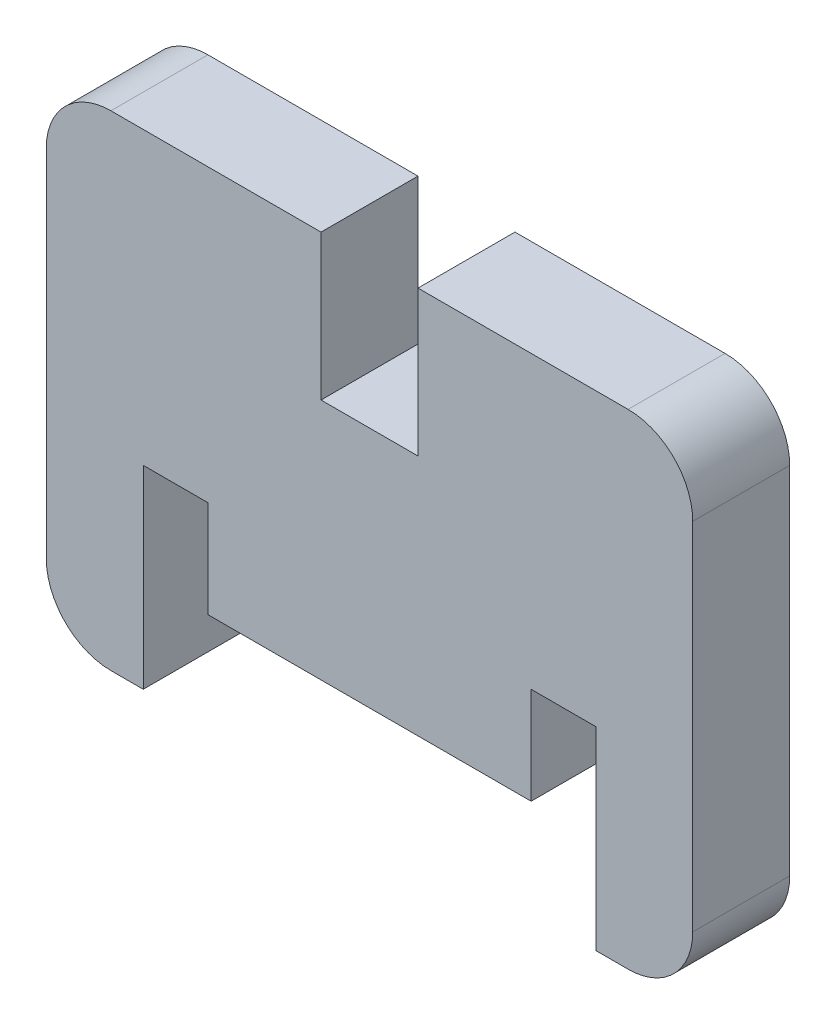
ISO-10303-21;
HEADER;
FILE_DESCRIPTION(('STEP AP214'),'2;1');
FILE_NAME('part.step','',(''),(''),'','','');
FILE_SCHEMA(('AUTOMOTIVE_DESIGN { 1 0 10303 214 1 1 1 1 }'));
ENDSEC;
DATA;
#1=APPLICATION_CONTEXT('core data for automotive mechanical design processes');
#2=APPLICATION_PROTOCOL_DEFINITION('international standard','automotive_design',2000,#1);
#3=PRODUCT_CONTEXT('',#1,'mechanical');
#4=PRODUCT('Part','Part','',(#3));
#5=PRODUCT_RELATED_PRODUCT_CATEGORY('part','',(#4));
#6=PRODUCT_DEFINITION_FORMATION('','',#4);
#7=PRODUCT_DEFINITION_CONTEXT('part definition',#1,'design');
#8=PRODUCT_DEFINITION('design','',#6,#7);
#9=PRODUCT_DEFINITION_SHAPE('','',#8);
#10=(LENGTH_UNIT() NAMED_UNIT(*) SI_UNIT(.MILLI.,.METRE.));
#11=(NAMED_UNIT(*) PLANE_ANGLE_UNIT() SI_UNIT($,.RADIAN.));
#12=(NAMED_UNIT(*) SI_UNIT($,.STERADIAN.) SOLID_ANGLE_UNIT());
#13=UNCERTAINTY_MEASURE_WITH_UNIT(LENGTH_MEASURE(1.E-05),#10,'distance_accuracy_value','');
#14=(GEOMETRIC_REPRESENTATION_CONTEXT(3) GLOBAL_UNCERTAINTY_ASSIGNED_CONTEXT((#13)) GLOBAL_UNIT_ASSIGNED_CONTEXT((#10,
#11,#12)) REPRESENTATION_CONTEXT('',''));
#15=CARTESIAN_POINT('',(0.,0.,0.));
#16=DIRECTION('',(0.,0.,1.));
#17=DIRECTION('',(1.,0.,0.));
#18=AXIS2_PLACEMENT_3D('',#15,#16,#17);
#19=CARTESIAN_POINT('',(0.,-37.5,15.));
#20=DIRECTION('',(0.,1.,0.));
#21=DIRECTION('',(0.,0.,1.));
#22=AXIS2_PLACEMENT_3D('',#19,#20,#21);
#23=PLANE('',#22);
#24=DIRECTION('',(1.,0.,0.));
#25=VECTOR('',#24,1.);
#26=CARTESIAN_POINT('',(0.,-37.5,0.));
#27=LINE('',#26,#25);
#28=CARTESIAN_POINT('',(35.,-37.5,0.));
#29=VERTEX_POINT('',#28);
#30=CARTESIAN_POINT('',(40.,-37.5,0.));
#31=VERTEX_POINT('',#30);
#32=EDGE_CURVE('E204',#29,#31,#27,.T.);
#33=ORIENTED_EDGE('',*,*,#32,.T.);
#34=DIRECTION('',(0.,0.,-1.));
#35=VECTOR('',#34,1.);
#36=CARTESIAN_POINT('',(40.,-37.5,15.));
#37=LINE('',#36,#35);
#38=CARTESIAN_POINT('',(40.,-37.5,15.));
#39=VERTEX_POINT('',#38);
#40=EDGE_CURVE('E11',#39,#31,#37,.T.);
#41=ORIENTED_EDGE('',*,*,#40,.F.);
#42=DIRECTION('',(1.,0.,0.));
#43=VECTOR('',#42,1.);
#44=CARTESIAN_POINT('',(0.,-37.5,15.));
#45=LINE('',#44,#43);
#46=CARTESIAN_POINT('',(35.,-37.5,15.));
#47=VERTEX_POINT('',#46);
#48=EDGE_CURVE('E253',#47,#39,#45,.T.);
#49=ORIENTED_EDGE('',*,*,#48,.F.);
#50=DIRECTION('',(0.,0.,-1.));
#51=VECTOR('',#50,1.);
#52=CARTESIAN_POINT('',(35.,-37.5,15.));
#53=LINE('',#52,#51);
#54=EDGE_CURVE('E51',#47,#29,#53,.T.);
#55=ORIENTED_EDGE('',*,*,#54,.T.);
#56=EDGE_LOOP('',(#33,#41,#49,#55));
#57=FACE_BOUND('',#56,.T.);
#58=ADVANCED_FACE('F34',(#57),#23,.F.);
#59=CARTESIAN_POINT('',(40.,-27.5,15.));
#60=DIRECTION('',(0.,0.,-1.));
#61=DIRECTION('',(-1.,0.,0.));
#62=AXIS2_PLACEMENT_3D('',#59,#60,#61);
#63=CYLINDRICAL_SURFACE('',#62,10.);
#64=CARTESIAN_POINT('',(40.,-27.5,0.));
#65=DIRECTION('',(0.,0.,1.));
#66=DIRECTION('',(1.,0.,0.));
#67=AXIS2_PLACEMENT_3D('',#64,#65,#66);
#68=CIRCLE('',#67,10.);
#69=CARTESIAN_POINT('',(50.,-27.4999999999999,0.));
#70=VERTEX_POINT('',#69);
#71=EDGE_CURVE('E206',#31,#70,#68,.T.);
#72=ORIENTED_EDGE('',*,*,#71,.T.);
#73=DIRECTION('',(0.,0.,-1.));
#74=VECTOR('',#73,1.);
#75=CARTESIAN_POINT('',(50.,-27.4999999999999,15.));
#76=LINE('',#75,#74);
#77=CARTESIAN_POINT('',(50.,-27.4999999999999,15.));
#78=VERTEX_POINT('',#77);
#79=EDGE_CURVE('E43',#78,#70,#76,.T.);
#80=ORIENTED_EDGE('',*,*,#79,.F.);
#81=CARTESIAN_POINT('',(40.,-27.5,15.));
#82=DIRECTION('',(0.,0.,1.));
#83=DIRECTION('',(1.,0.,0.));
#84=AXIS2_PLACEMENT_3D('',#81,#82,#83);
#85=CIRCLE('',#84,10.);
#86=EDGE_CURVE('E125',#39,#78,#85,.T.);
#87=ORIENTED_EDGE('',*,*,#86,.F.);
#88=ORIENTED_EDGE('',*,*,#40,.T.);
#89=EDGE_LOOP('',(#72,#80,#87,#88));
#90=FACE_BOUND('',#89,.T.);
#91=ADVANCED_FACE('F36',(#90),#63,.T.);
#92=CARTESIAN_POINT('',(50.,0.,15.));
#93=DIRECTION('',(-1.,0.,0.));
#94=DIRECTION('',(0.,0.,1.));
#95=AXIS2_PLACEMENT_3D('',#92,#93,#94);
#96=PLANE('',#95);
#97=DIRECTION('',(0.,1.,0.));
#98=VECTOR('',#97,1.);
#99=CARTESIAN_POINT('',(50.,0.,0.));
#100=LINE('',#99,#98);
#101=CARTESIAN_POINT('',(50.,27.4999999999999,0.));
#102=VERTEX_POINT('',#101);
#103=EDGE_CURVE('E209',#70,#102,#100,.T.);
#104=ORIENTED_EDGE('',*,*,#103,.T.);
#105=DIRECTION('',(0.,0.,-1.));
#106=VECTOR('',#105,1.);
#107=CARTESIAN_POINT('',(50.,27.4999999999999,15.));
#108=LINE('',#107,#106);
#109=CARTESIAN_POINT('',(50.,27.4999999999999,15.));
#110=VERTEX_POINT('',#109);
#111=EDGE_CURVE('E285',#110,#102,#108,.T.);
#112=ORIENTED_EDGE('',*,*,#111,.F.);
#113=DIRECTION('',(0.,1.,0.));
#114=VECTOR('',#113,1.);
#115=CARTESIAN_POINT('',(50.,0.,15.));
#116=LINE('',#115,#114);
#117=EDGE_CURVE('E293',#78,#110,#116,.T.);
#118=ORIENTED_EDGE('',*,*,#117,.F.);
#119=ORIENTED_EDGE('',*,*,#79,.T.);
#120=EDGE_LOOP('',(#104,#112,#118,#119));
#121=FACE_BOUND('',#120,.T.);
#122=ADVANCED_FACE('F291',(#121),#96,.F.);
#123=CARTESIAN_POINT('',(40.,27.5,15.));
#124=DIRECTION('',(0.,0.,-1.));
#125=DIRECTION('',(-1.,0.,0.));
#126=AXIS2_PLACEMENT_3D('',#123,#124,#125);
#127=CYLINDRICAL_SURFACE('',#126,10.);
#128=CARTESIAN_POINT('',(40.,27.5,0.));
#129=DIRECTION('',(0.,0.,1.));
#130=DIRECTION('',(1.,0.,0.));
#131=AXIS2_PLACEMENT_3D('',#128,#129,#130);
#132=CIRCLE('',#131,10.);
#133=CARTESIAN_POINT('',(40.,37.5,0.));
#134=VERTEX_POINT('',#133);
#135=EDGE_CURVE('E211',#102,#134,#132,.T.);
#136=ORIENTED_EDGE('',*,*,#135,.T.);
#137=DIRECTION('',(0.,0.,-1.));
#138=VECTOR('',#137,1.);
#139=CARTESIAN_POINT('',(40.,37.5,15.));
#140=LINE('',#139,#138);
#141=CARTESIAN_POINT('',(40.,37.5,15.));
#142=VERTEX_POINT('',#141);
#143=EDGE_CURVE('E283',#142,#134,#140,.T.);
#144=ORIENTED_EDGE('',*,*,#143,.F.);
#145=CARTESIAN_POINT('',(40.,27.5,15.));
#146=DIRECTION('',(0.,0.,1.));
#147=DIRECTION('',(1.,0.,0.));
#148=AXIS2_PLACEMENT_3D('',#145,#146,#147);
#149=CIRCLE('',#148,10.);
#150=EDGE_CURVE('E303',#110,#142,#149,.T.);
#151=ORIENTED_EDGE('',*,*,#150,.F.);
#152=ORIENTED_EDGE('',*,*,#111,.T.);
#153=EDGE_LOOP('',(#136,#144,#151,#152));
#154=FACE_BOUND('',#153,.T.);
#155=ADVANCED_FACE('F300',(#154),#127,.T.);
#156=CARTESIAN_POINT('',(0.,37.5,15.));
#157=DIRECTION('',(0.,1.,0.));
#158=DIRECTION('',(0.,0.,1.));
#159=AXIS2_PLACEMENT_3D('',#156,#157,#158);
#160=PLANE('',#159);
#161=DIRECTION('',(1.,0.,0.));
#162=VECTOR('',#161,1.);
#163=CARTESIAN_POINT('',(0.,37.5,0.));
#164=LINE('',#163,#162);
#165=CARTESIAN_POINT('',(7.50000000000001,37.5,0.));
#166=VERTEX_POINT('',#165);
#167=EDGE_CURVE('E214',#166,#134,#164,.T.);
#168=ORIENTED_EDGE('',*,*,#167,.F.);
#169=DIRECTION('',(0.,0.,-1.));
#170=VECTOR('',#169,1.);
#171=CARTESIAN_POINT('',(7.50000000000001,37.5,15.));
#172=LINE('',#171,#170);
#173=CARTESIAN_POINT('',(7.50000000000001,37.5,15.));
#174=VERTEX_POINT('',#173);
#175=EDGE_CURVE('E281',#174,#166,#172,.T.);
#176=ORIENTED_EDGE('',*,*,#175,.F.);
#177=DIRECTION('',(1.,0.,0.));
#178=VECTOR('',#177,1.);
#179=CARTESIAN_POINT('',(0.,37.5,15.));
#180=LINE('',#179,#178);
#181=EDGE_CURVE('E305',#174,#142,#180,.T.);
#182=ORIENTED_EDGE('',*,*,#181,.T.);
#183=ORIENTED_EDGE('',*,*,#143,.T.);
#184=EDGE_LOOP('',(#168,#176,#182,#183));
#185=FACE_BOUND('',#184,.T.);
#186=ADVANCED_FACE('F410',(#185),#160,.T.);
#187=CARTESIAN_POINT('',(7.50000000000001,0.,15.));
#188=DIRECTION('',(-1.,0.,0.));
#189=DIRECTION('',(0.,0.,1.));
#190=AXIS2_PLACEMENT_3D('',#187,#188,#189);
#191=PLANE('',#190);
#192=DIRECTION('',(0.,1.,0.));
#193=VECTOR('',#192,1.);
#194=CARTESIAN_POINT('',(7.50000000000001,0.,0.));
#195=LINE('',#194,#193);
#196=CARTESIAN_POINT('',(7.50000000000001,15.,0.));
#197=VERTEX_POINT('',#196);
#198=EDGE_CURVE('E217',#197,#166,#195,.T.);
#199=ORIENTED_EDGE('',*,*,#198,.F.);
#200=DIRECTION('',(0.,0.,-1.));
#201=VECTOR('',#200,1.);
#202=CARTESIAN_POINT('',(7.50000000000001,15.,15.));
#203=LINE('',#202,#201);
#204=CARTESIAN_POINT('',(7.50000000000001,15.,15.));
#205=VERTEX_POINT('',#204);
#206=EDGE_CURVE('E279',#205,#197,#203,.T.);
#207=ORIENTED_EDGE('',*,*,#206,.F.);
#208=DIRECTION('',(0.,1.,0.));
#209=VECTOR('',#208,1.);
#210=CARTESIAN_POINT('',(7.50000000000001,0.,15.));
#211=LINE('',#210,#209);
#212=EDGE_CURVE('E307',#205,#174,#211,.T.);
#213=ORIENTED_EDGE('',*,*,#212,.T.);
#214=ORIENTED_EDGE('',*,*,#175,.T.);
#215=EDGE_LOOP('',(#199,#207,#213,#214));
#216=FACE_BOUND('',#215,.T.);
#217=ADVANCED_FACE('F408',(#216),#191,.T.);
#218=CARTESIAN_POINT('',(0.,15.,15.));
#219=DIRECTION('',(0.,1.,0.));
#220=DIRECTION('',(0.,0.,1.));
#221=AXIS2_PLACEMENT_3D('',#218,#219,#220);
#222=PLANE('',#221);
#223=DIRECTION('',(1.,0.,0.));
#224=VECTOR('',#223,1.);
#225=CARTESIAN_POINT('',(0.,15.,0.));
#226=LINE('',#225,#224);
#227=CARTESIAN_POINT('',(-7.49999999999999,15.,0.));
#228=VERTEX_POINT('',#227);
#229=EDGE_CURVE('E221',#228,#197,#226,.T.);
#230=ORIENTED_EDGE('',*,*,#229,.F.);
#231=DIRECTION('',(0.,0.,-1.));
#232=VECTOR('',#231,1.);
#233=CARTESIAN_POINT('',(-7.49999999999999,15.,15.));
#234=LINE('',#233,#232);
#235=CARTESIAN_POINT('',(-7.49999999999999,15.,15.));
#236=VERTEX_POINT('',#235);
#237=EDGE_CURVE('E277',#236,#228,#234,.T.);
#238=ORIENTED_EDGE('',*,*,#237,.F.);
#239=DIRECTION('',(1.,0.,0.));
#240=VECTOR('',#239,1.);
#241=CARTESIAN_POINT('',(0.,15.,15.));
#242=LINE('',#241,#240);
#243=EDGE_CURVE('E315',#236,#205,#242,.T.);
#244=ORIENTED_EDGE('',*,*,#243,.T.);
#245=ORIENTED_EDGE('',*,*,#206,.T.);
#246=EDGE_LOOP('',(#230,#238,#244,#245));
#247=FACE_BOUND('',#246,.T.);
#248=ADVANCED_FACE('F402',(#247),#222,.T.);
#249=CARTESIAN_POINT('',(-7.49999999999999,0.,15.));
#250=DIRECTION('',(-1.,0.,0.));
#251=DIRECTION('',(0.,0.,1.));
#252=AXIS2_PLACEMENT_3D('',#249,#250,#251);
#253=PLANE('',#252);
#254=DIRECTION('',(0.,1.,0.));
#255=VECTOR('',#254,1.);
#256=CARTESIAN_POINT('',(-7.49999999999999,0.,0.));
#257=LINE('',#256,#255);
#258=CARTESIAN_POINT('',(-7.49999999999999,37.5,0.));
#259=VERTEX_POINT('',#258);
#260=EDGE_CURVE('E224',#228,#259,#257,.T.);
#261=ORIENTED_EDGE('',*,*,#260,.T.);
#262=DIRECTION('',(0.,0.,-1.));
#263=VECTOR('',#262,1.);
#264=CARTESIAN_POINT('',(-7.49999999999999,37.5,15.));
#265=LINE('',#264,#263);
#266=CARTESIAN_POINT('',(-7.49999999999999,37.5,15.));
#267=VERTEX_POINT('',#266);
#268=EDGE_CURVE('E275',#267,#259,#265,.T.);
#269=ORIENTED_EDGE('',*,*,#268,.F.);
#270=DIRECTION('',(0.,1.,0.));
#271=VECTOR('',#270,1.);
#272=CARTESIAN_POINT('',(-7.49999999999999,0.,15.));
#273=LINE('',#272,#271);
#274=EDGE_CURVE('E318',#236,#267,#273,.T.);
#275=ORIENTED_EDGE('',*,*,#274,.F.);
#276=ORIENTED_EDGE('',*,*,#237,.T.);
#277=EDGE_LOOP('',(#261,#269,#275,#276));
#278=FACE_BOUND('',#277,.T.);
#279=ADVANCED_FACE('F411',(#278),#253,.F.);
#280=CARTESIAN_POINT('',(-39.9999999999999,37.5,0.));
#281=VERTEX_POINT('',#280);
#282=EDGE_CURVE('E218',#281,#259,#164,.T.);
#283=ORIENTED_EDGE('',*,*,#282,.F.);
#284=DIRECTION('',(0.,0.,-1.));
#285=VECTOR('',#284,1.);
#286=CARTESIAN_POINT('',(-39.9999999999999,37.5,15.));
#287=LINE('',#286,#285);
#288=CARTESIAN_POINT('',(-39.9999999999999,37.5,15.));
#289=VERTEX_POINT('',#288);
#290=EDGE_CURVE('E273',#289,#281,#287,.T.);
#291=ORIENTED_EDGE('',*,*,#290,.F.);
#292=EDGE_CURVE('E309',#289,#267,#180,.T.);
#293=ORIENTED_EDGE('',*,*,#292,.T.);
#294=ORIENTED_EDGE('',*,*,#268,.T.);
#295=EDGE_LOOP('',(#283,#291,#293,#294));
#296=FACE_BOUND('',#295,.T.);
#297=ADVANCED_FACE('F396',(#296),#160,.T.);
#298=CARTESIAN_POINT('',(-40.,27.5,15.));
#299=DIRECTION('',(0.,0.,-1.));
#300=DIRECTION('',(-1.,0.,0.));
#301=AXIS2_PLACEMENT_3D('',#298,#299,#300);
#302=CYLINDRICAL_SURFACE('',#301,10.);
#303=CARTESIAN_POINT('',(-40.,27.5,0.));
#304=DIRECTION('',(0.,0.,1.));
#305=DIRECTION('',(1.,0.,0.));
#306=AXIS2_PLACEMENT_3D('',#303,#304,#305);
#307=CIRCLE('',#306,10.);
#308=CARTESIAN_POINT('',(-50.,27.4999999999999,0.));
#309=VERTEX_POINT('',#308);
#310=EDGE_CURVE('E227',#281,#309,#307,.T.);
#311=ORIENTED_EDGE('',*,*,#310,.T.);
#312=DIRECTION('',(0.,0.,-1.));
#313=VECTOR('',#312,1.);
#314=CARTESIAN_POINT('',(-50.,27.4999999999999,15.));
#315=LINE('',#314,#313);
#316=CARTESIAN_POINT('',(-50.,27.4999999999999,15.));
#317=VERTEX_POINT('',#316);
#318=EDGE_CURVE('E271',#317,#309,#315,.T.);
#319=ORIENTED_EDGE('',*,*,#318,.F.);
#320=CARTESIAN_POINT('',(-40.,27.5,15.));
#321=DIRECTION('',(0.,0.,1.));
#322=DIRECTION('',(1.,0.,0.));
#323=AXIS2_PLACEMENT_3D('',#320,#321,#322);
#324=CIRCLE('',#323,10.);
#325=EDGE_CURVE('E320',#289,#317,#324,.T.);
#326=ORIENTED_EDGE('',*,*,#325,.F.);
#327=ORIENTED_EDGE('',*,*,#290,.T.);
#328=EDGE_LOOP('',(#311,#319,#326,#327));
#329=FACE_BOUND('',#328,.T.);
#330=ADVANCED_FACE('F392',(#329),#302,.T.);
#331=CARTESIAN_POINT('',(-50.,0.,15.));
#332=DIRECTION('',(-1.,0.,0.));
#333=DIRECTION('',(0.,0.,1.));
#334=AXIS2_PLACEMENT_3D('',#331,#332,#333);
#335=PLANE('',#334);
#336=DIRECTION('',(0.,1.,0.));
#337=VECTOR('',#336,1.);
#338=CARTESIAN_POINT('',(-50.,0.,0.));
#339=LINE('',#338,#337);
#340=CARTESIAN_POINT('',(-50.,-27.4999999999999,0.));
#341=VERTEX_POINT('',#340);
#342=EDGE_CURVE('E230',#341,#309,#339,.T.);
#343=ORIENTED_EDGE('',*,*,#342,.F.);
#344=DIRECTION('',(0.,0.,-1.));
#345=VECTOR('',#344,1.);
#346=CARTESIAN_POINT('',(-50.,-27.4999999999999,15.));
#347=LINE('',#346,#345);
#348=CARTESIAN_POINT('',(-50.,-27.4999999999999,15.));
#349=VERTEX_POINT('',#348);
#350=EDGE_CURVE('E269',#349,#341,#347,.T.);
#351=ORIENTED_EDGE('',*,*,#350,.F.);
#352=DIRECTION('',(0.,1.,0.));
#353=VECTOR('',#352,1.);
#354=CARTESIAN_POINT('',(-50.,0.,15.));
#355=LINE('',#354,#353);
#356=EDGE_CURVE('E322',#349,#317,#355,.T.);
#357=ORIENTED_EDGE('',*,*,#356,.T.);
#358=ORIENTED_EDGE('',*,*,#318,.T.);
#359=EDGE_LOOP('',(#343,#351,#357,#358));
#360=FACE_BOUND('',#359,.T.);
#361=ADVANCED_FACE('F367',(#360),#335,.T.);
#362=CARTESIAN_POINT('',(-40.,-27.5,15.));
#363=DIRECTION('',(0.,0.,-1.));
#364=DIRECTION('',(-1.,0.,0.));
#365=AXIS2_PLACEMENT_3D('',#362,#363,#364);
#366=CYLINDRICAL_SURFACE('',#365,10.);
#367=CARTESIAN_POINT('',(-40.,-27.5,0.));
#368=DIRECTION('',(0.,0.,1.));
#369=DIRECTION('',(1.,0.,0.));
#370=AXIS2_PLACEMENT_3D('',#367,#368,#369);
#371=CIRCLE('',#370,10.);
#372=CARTESIAN_POINT('',(-39.9999999999999,-37.5,0.));
#373=VERTEX_POINT('',#372);
#374=EDGE_CURVE('E233',#373,#341,#371,.F.);
#375=ORIENTED_EDGE('',*,*,#374,.F.);
#376=DIRECTION('',(0.,0.,-1.));
#377=VECTOR('',#376,1.);
#378=CARTESIAN_POINT('',(-39.9999999999999,-37.5,15.));
#379=LINE('',#378,#377);
#380=CARTESIAN_POINT('',(-39.9999999999999,-37.5,15.));
#381=VERTEX_POINT('',#380);
#382=EDGE_CURVE('E267',#381,#373,#379,.T.);
#383=ORIENTED_EDGE('',*,*,#382,.F.);
#384=CARTESIAN_POINT('',(-40.,-27.5,15.));
#385=DIRECTION('',(0.,0.,1.));
#386=DIRECTION('',(1.,0.,0.));
#387=AXIS2_PLACEMENT_3D('',#384,#385,#386);
#388=CIRCLE('',#387,10.);
#389=EDGE_CURVE('E325',#381,#349,#388,.F.);
#390=ORIENTED_EDGE('',*,*,#389,.T.);
#391=ORIENTED_EDGE('',*,*,#350,.T.);
#392=EDGE_LOOP('',(#375,#383,#390,#391));
#393=FACE_BOUND('',#392,.T.);
#394=ADVANCED_FACE('F359',(#393),#366,.T.);
#395=CARTESIAN_POINT('',(-35.,-37.5,0.));
#396=VERTEX_POINT('',#395);
#397=EDGE_CURVE('E207',#373,#396,#27,.T.);
#398=ORIENTED_EDGE('',*,*,#397,.T.);
#399=DIRECTION('',(0.,0.,-1.));
#400=VECTOR('',#399,1.);
#401=CARTESIAN_POINT('',(-35.,-37.5,15.));
#402=LINE('',#401,#400);
#403=CARTESIAN_POINT('',(-35.,-37.5,15.));
#404=VERTEX_POINT('',#403);
#405=EDGE_CURVE('E264',#404,#396,#402,.T.);
#406=ORIENTED_EDGE('',*,*,#405,.F.);
#407=EDGE_CURVE('E328',#381,#404,#45,.T.);
#408=ORIENTED_EDGE('',*,*,#407,.F.);
#409=ORIENTED_EDGE('',*,*,#382,.T.);
#410=EDGE_LOOP('',(#398,#406,#408,#409));
#411=FACE_BOUND('',#410,.T.);
#412=ADVANCED_FACE('F351',(#411),#23,.F.);
#413=CARTESIAN_POINT('',(-35.0000000000001,-1.13335267097152E-13,15.));
#414=DIRECTION('',(-1.,0.,0.));
#415=DIRECTION('',(0.,-1.,0.));
#416=AXIS2_PLACEMENT_3D('',#413,#414,#415);
#417=PLANE('',#416);
#418=DIRECTION('',(0.,1.,0.));
#419=VECTOR('',#418,1.);
#420=CARTESIAN_POINT('',(-35.0000000000001,-1.13335267097152E-13,0.));
#421=LINE('',#420,#419);
#422=CARTESIAN_POINT('',(-35.,-7.50000000000005,0.));
#423=VERTEX_POINT('',#422);
#424=EDGE_CURVE('E236',#396,#423,#421,.T.);
#425=ORIENTED_EDGE('',*,*,#424,.T.);
#426=DIRECTION('',(0.,0.,-1.));
#427=VECTOR('',#426,1.);
#428=CARTESIAN_POINT('',(-35.,-7.50000000000005,15.));
#429=LINE('',#428,#427);
#430=CARTESIAN_POINT('',(-35.,-7.50000000000005,15.));
#431=VERTEX_POINT('',#430);
#432=EDGE_CURVE('E261',#431,#423,#429,.T.);
#433=ORIENTED_EDGE('',*,*,#432,.F.);
#434=DIRECTION('',(0.,1.,0.));
#435=VECTOR('',#434,1.);
#436=CARTESIAN_POINT('',(-35.0000000000001,-1.13335267097152E-13,15.));
#437=LINE('',#436,#435);
#438=EDGE_CURVE('E329',#404,#431,#437,.T.);
#439=ORIENTED_EDGE('',*,*,#438,.F.);
#440=ORIENTED_EDGE('',*,*,#405,.T.);
#441=EDGE_LOOP('',(#425,#433,#439,#440));
#442=FACE_BOUND('',#441,.T.);
#443=ADVANCED_FACE('F358',(#442),#417,.F.);
#444=CARTESIAN_POINT('',(0.,-7.50000000000005,15.));
#445=DIRECTION('',(0.,1.,0.));
#446=DIRECTION('',(-1.,0.,0.));
#447=AXIS2_PLACEMENT_3D('',#444,#445,#446);
#448=PLANE('',#447);
#449=DIRECTION('',(1.,0.,0.));
#450=VECTOR('',#449,1.);
#451=CARTESIAN_POINT('',(0.,-7.50000000000005,0.));
#452=LINE('',#451,#450);
#453=CARTESIAN_POINT('',(-25.,-7.50000000000005,0.));
#454=VERTEX_POINT('',#453);
#455=EDGE_CURVE('E238',#423,#454,#452,.T.);
#456=ORIENTED_EDGE('',*,*,#455,.T.);
#457=DIRECTION('',(0.,0.,-1.));
#458=VECTOR('',#457,1.);
#459=CARTESIAN_POINT('',(-25.,-7.50000000000005,15.));
#460=LINE('',#459,#458);
#461=CARTESIAN_POINT('',(-25.,-7.50000000000005,15.));
#462=VERTEX_POINT('',#461);
#463=EDGE_CURVE('E259',#462,#454,#460,.T.);
#464=ORIENTED_EDGE('',*,*,#463,.F.);
#465=DIRECTION('',(1.,0.,0.));
#466=VECTOR('',#465,1.);
#467=CARTESIAN_POINT('',(0.,-7.50000000000005,15.));
#468=LINE('',#467,#466);
#469=EDGE_CURVE('E331',#431,#462,#468,.T.);
#470=ORIENTED_EDGE('',*,*,#469,.F.);
#471=ORIENTED_EDGE('',*,*,#432,.T.);
#472=EDGE_LOOP('',(#456,#464,#470,#471));
#473=FACE_BOUND('',#472,.T.);
#474=ADVANCED_FACE('F365',(#473),#448,.F.);
#475=CARTESIAN_POINT('',(-25.,0.,15.));
#476=DIRECTION('',(-1.,0.,0.));
#477=DIRECTION('',(0.,0.,1.));
#478=AXIS2_PLACEMENT_3D('',#475,#476,#477);
#479=PLANE('',#478);
#480=DIRECTION('',(0.,1.,0.));
#481=VECTOR('',#480,1.);
#482=CARTESIAN_POINT('',(-25.,0.,0.));
#483=LINE('',#482,#481);
#484=CARTESIAN_POINT('',(-25.,-22.5000000000001,0.));
#485=VERTEX_POINT('',#484);
#486=EDGE_CURVE('E241',#485,#454,#483,.T.);
#487=ORIENTED_EDGE('',*,*,#486,.F.);
#488=DIRECTION('',(0.,0.,-1.));
#489=VECTOR('',#488,1.);
#490=CARTESIAN_POINT('',(-25.,-22.5000000000001,15.));
#491=LINE('',#490,#489);
#492=CARTESIAN_POINT('',(-25.,-22.5000000000001,15.));
#493=VERTEX_POINT('',#492);
#494=EDGE_CURVE('E257',#493,#485,#491,.T.);
#495=ORIENTED_EDGE('',*,*,#494,.F.);
#496=DIRECTION('',(0.,1.,0.));
#497=VECTOR('',#496,1.);
#498=CARTESIAN_POINT('',(-25.,0.,15.));
#499=LINE('',#498,#497);
#500=EDGE_CURVE('E333',#493,#462,#499,.T.);
#501=ORIENTED_EDGE('',*,*,#500,.T.);
#502=ORIENTED_EDGE('',*,*,#463,.T.);
#503=EDGE_LOOP('',(#487,#495,#501,#502));
#504=FACE_BOUND('',#503,.T.);
#505=ADVANCED_FACE('F498',(#504),#479,.T.);
#506=CARTESIAN_POINT('',(0.,-22.5,15.));
#507=DIRECTION('',(0.,-1.,0.));
#508=DIRECTION('',(1.,0.,0.));
#509=AXIS2_PLACEMENT_3D('',#506,#507,#508);
#510=PLANE('',#509);
#511=DIRECTION('',(-1.,0.,0.));
#512=VECTOR('',#511,1.);
#513=CARTESIAN_POINT('',(0.,-22.5,0.));
#514=LINE('',#513,#512);
#515=CARTESIAN_POINT('',(25.,-22.5,0.));
#516=VERTEX_POINT('',#515);
#517=EDGE_CURVE('E244',#516,#485,#514,.T.);
#518=ORIENTED_EDGE('',*,*,#517,.F.);
#519=DIRECTION('',(0.,0.,-1.));
#520=VECTOR('',#519,1.);
#521=CARTESIAN_POINT('',(25.,-22.5,15.));
#522=LINE('',#521,#520);
#523=CARTESIAN_POINT('',(25.,-22.5,15.));
#524=VERTEX_POINT('',#523);
#525=EDGE_CURVE('E196',#524,#516,#522,.T.);
#526=ORIENTED_EDGE('',*,*,#525,.F.);
#527=DIRECTION('',(-1.,0.,0.));
#528=VECTOR('',#527,1.);
#529=CARTESIAN_POINT('',(0.,-22.5,15.));
#530=LINE('',#529,#528);
#531=EDGE_CURVE('E186',#524,#493,#530,.T.);
#532=ORIENTED_EDGE('',*,*,#531,.T.);
#533=ORIENTED_EDGE('',*,*,#494,.T.);
#534=EDGE_LOOP('',(#518,#526,#532,#533));
#535=FACE_BOUND('',#534,.T.);
#536=ADVANCED_FACE('F337',(#535),#510,.T.);
#537=CARTESIAN_POINT('',(25.,0.,15.));
#538=DIRECTION('',(-1.,0.,0.));
#539=DIRECTION('',(0.,0.,1.));
#540=AXIS2_PLACEMENT_3D('',#537,#538,#539);
#541=PLANE('',#540);
#542=DIRECTION('',(0.,1.,0.));
#543=VECTOR('',#542,1.);
#544=CARTESIAN_POINT('',(25.,0.,0.));
#545=LINE('',#544,#543);
#546=CARTESIAN_POINT('',(25.,-7.50000000000004,0.));
#547=VERTEX_POINT('',#546);
#548=EDGE_CURVE('E193',#516,#547,#545,.T.);
#549=ORIENTED_EDGE('',*,*,#548,.T.);
#550=DIRECTION('',(0.,0.,-1.));
#551=VECTOR('',#550,1.);
#552=CARTESIAN_POINT('',(25.,-7.50000000000004,15.));
#553=LINE('',#552,#551);
#554=CARTESIAN_POINT('',(25.,-7.50000000000004,15.));
#555=VERTEX_POINT('',#554);
#556=EDGE_CURVE('E190',#555,#547,#553,.T.);
#557=ORIENTED_EDGE('',*,*,#556,.F.);
#558=DIRECTION('',(0.,1.,0.));
#559=VECTOR('',#558,1.);
#560=CARTESIAN_POINT('',(25.,0.,15.));
#561=LINE('',#560,#559);
#562=EDGE_CURVE('E178',#524,#555,#561,.T.);
#563=ORIENTED_EDGE('',*,*,#562,.F.);
#564=ORIENTED_EDGE('',*,*,#525,.T.);
#565=EDGE_LOOP('',(#549,#557,#563,#564));
#566=FACE_BOUND('',#565,.T.);
#567=ADVANCED_FACE('F191',(#566),#541,.F.);
#568=CARTESIAN_POINT('',(0.,-7.50000000000005,15.));
#569=DIRECTION('',(0.,-1.,0.));
#570=DIRECTION('',(1.,0.,0.));
#571=AXIS2_PLACEMENT_3D('',#568,#569,#570);
#572=PLANE('',#571);
#573=DIRECTION('',(-1.,0.,0.));
#574=VECTOR('',#573,1.);
#575=CARTESIAN_POINT('',(0.,-7.50000000000005,0.));
#576=LINE('',#575,#574);
#577=CARTESIAN_POINT('',(35.,-7.50000000000004,0.));
#578=VERTEX_POINT('',#577);
#579=EDGE_CURVE('E248',#578,#547,#576,.T.);
#580=ORIENTED_EDGE('',*,*,#579,.F.);
#581=DIRECTION('',(0.,0.,-1.));
#582=VECTOR('',#581,1.);
#583=CARTESIAN_POINT('',(35.,-7.50000000000004,15.));
#584=LINE('',#583,#582);
#585=CARTESIAN_POINT('',(35.,-7.50000000000004,15.));
#586=VERTEX_POINT('',#585);
#587=EDGE_CURVE('E113',#586,#578,#584,.T.);
#588=ORIENTED_EDGE('',*,*,#587,.F.);
#589=DIRECTION('',(-1.,0.,0.));
#590=VECTOR('',#589,1.);
#591=CARTESIAN_POINT('',(0.,-7.50000000000005,15.));
#592=LINE('',#591,#590);
#593=EDGE_CURVE('E183',#586,#555,#592,.T.);
#594=ORIENTED_EDGE('',*,*,#593,.T.);
#595=ORIENTED_EDGE('',*,*,#556,.T.);
#596=EDGE_LOOP('',(#580,#588,#594,#595));
#597=FACE_BOUND('',#596,.T.);
#598=ADVANCED_FACE('F198',(#597),#572,.T.);
#599=CARTESIAN_POINT('',(35.0000000000001,0.,15.));
#600=DIRECTION('',(-1.,0.,0.));
#601=DIRECTION('',(0.,-1.,0.));
#602=AXIS2_PLACEMENT_3D('',#599,#600,#601);
#603=PLANE('',#602);
#604=DIRECTION('',(0.,1.,0.));
#605=VECTOR('',#604,1.);
#606=CARTESIAN_POINT('',(35.0000000000001,0.,0.));
#607=LINE('',#606,#605);
#608=EDGE_CURVE('E250',#29,#578,#607,.T.);
#609=ORIENTED_EDGE('',*,*,#608,.F.);
#610=ORIENTED_EDGE('',*,*,#54,.F.);
#611=DIRECTION('',(0.,1.,0.));
#612=VECTOR('',#611,1.);
#613=CARTESIAN_POINT('',(35.0000000000001,0.,15.));
#614=LINE('',#613,#612);
#615=EDGE_CURVE('E199',#47,#586,#614,.T.);
#616=ORIENTED_EDGE('',*,*,#615,.T.);
#617=ORIENTED_EDGE('',*,*,#587,.T.);
#618=EDGE_LOOP('',(#609,#610,#616,#617));
#619=FACE_BOUND('',#618,.T.);
#620=ADVANCED_FACE('F339',(#619),#603,.T.);
#621=CARTESIAN_POINT('',(0.,0.,15.));
#622=DIRECTION('',(0.,0.,1.));
#623=DIRECTION('',(1.,0.,0.));
#624=AXIS2_PLACEMENT_3D('',#621,#622,#623);
#625=PLANE('',#624);
#626=ORIENTED_EDGE('',*,*,#48,.T.);
#627=ORIENTED_EDGE('',*,*,#86,.T.);
#628=ORIENTED_EDGE('',*,*,#117,.T.);
#629=ORIENTED_EDGE('',*,*,#150,.T.);
#630=ORIENTED_EDGE('',*,*,#181,.F.);
#631=ORIENTED_EDGE('',*,*,#212,.F.);
#632=ORIENTED_EDGE('',*,*,#243,.F.);
#633=ORIENTED_EDGE('',*,*,#274,.T.);
#634=ORIENTED_EDGE('',*,*,#292,.F.);
#635=ORIENTED_EDGE('',*,*,#325,.T.);
#636=ORIENTED_EDGE('',*,*,#356,.F.);
#637=ORIENTED_EDGE('',*,*,#389,.F.);
#638=ORIENTED_EDGE('',*,*,#407,.T.);
#639=ORIENTED_EDGE('',*,*,#438,.T.);
#640=ORIENTED_EDGE('',*,*,#469,.T.);
#641=ORIENTED_EDGE('',*,*,#500,.F.);
#642=ORIENTED_EDGE('',*,*,#531,.F.);
#643=ORIENTED_EDGE('',*,*,#562,.T.);
#644=ORIENTED_EDGE('',*,*,#593,.F.);
#645=ORIENTED_EDGE('',*,*,#615,.F.);
#646=EDGE_LOOP('',(#626,#627,#628,#629,#630,#631,#632,#633,#634,#635,#636,#637,#638,#639,#640,
#641,#642,#643,#644,#645));
#647=FACE_BOUND('',#646,.T.);
#648=ADVANCED_FACE('F180',(#647),#625,.T.);
#649=CARTESIAN_POINT('',(0.,0.,0.));
#650=DIRECTION('',(0.,0.,1.));
#651=DIRECTION('',(1.,0.,0.));
#652=AXIS2_PLACEMENT_3D('',#649,#650,#651);
#653=PLANE('',#652);
#654=ORIENTED_EDGE('',*,*,#32,.F.);
#655=ORIENTED_EDGE('',*,*,#608,.T.);
#656=ORIENTED_EDGE('',*,*,#579,.T.);
#657=ORIENTED_EDGE('',*,*,#548,.F.);
#658=ORIENTED_EDGE('',*,*,#517,.T.);
#659=ORIENTED_EDGE('',*,*,#486,.T.);
#660=ORIENTED_EDGE('',*,*,#455,.F.);
#661=ORIENTED_EDGE('',*,*,#424,.F.);
#662=ORIENTED_EDGE('',*,*,#397,.F.);
#663=ORIENTED_EDGE('',*,*,#374,.T.);
#664=ORIENTED_EDGE('',*,*,#342,.T.);
#665=ORIENTED_EDGE('',*,*,#310,.F.);
#666=ORIENTED_EDGE('',*,*,#282,.T.);
#667=ORIENTED_EDGE('',*,*,#260,.F.);
#668=ORIENTED_EDGE('',*,*,#229,.T.);
#669=ORIENTED_EDGE('',*,*,#198,.T.);
#670=ORIENTED_EDGE('',*,*,#167,.T.);
#671=ORIENTED_EDGE('',*,*,#135,.F.);
#672=ORIENTED_EDGE('',*,*,#103,.F.);
#673=ORIENTED_EDGE('',*,*,#71,.F.);
#674=EDGE_LOOP('',(#654,#655,#656,#657,#658,#659,#660,#661,#662,#663,#664,#665,#666,#667,#668,
#669,#670,#671,#672,#673));
#675=FACE_BOUND('',#674,.T.);
#676=ADVANCED_FACE('F296',(#675),#653,.F.);
#677=CLOSED_SHELL('',(#58,#91,#122,#155,#186,#217,#248,#279,#297,#330,#361,#394,#412,#443,#474,
#505,#536,#567,#598,#620,#648,#676));
#678=MANIFOLD_SOLID_BREP('B2',#677);
#679=ADVANCED_BREP_SHAPE_REPRESENTATION('',(#18,#678),#14);
#680=SHAPE_DEFINITION_REPRESENTATION(#9,#679);
ENDSEC;
END-ISO-10303-21;
